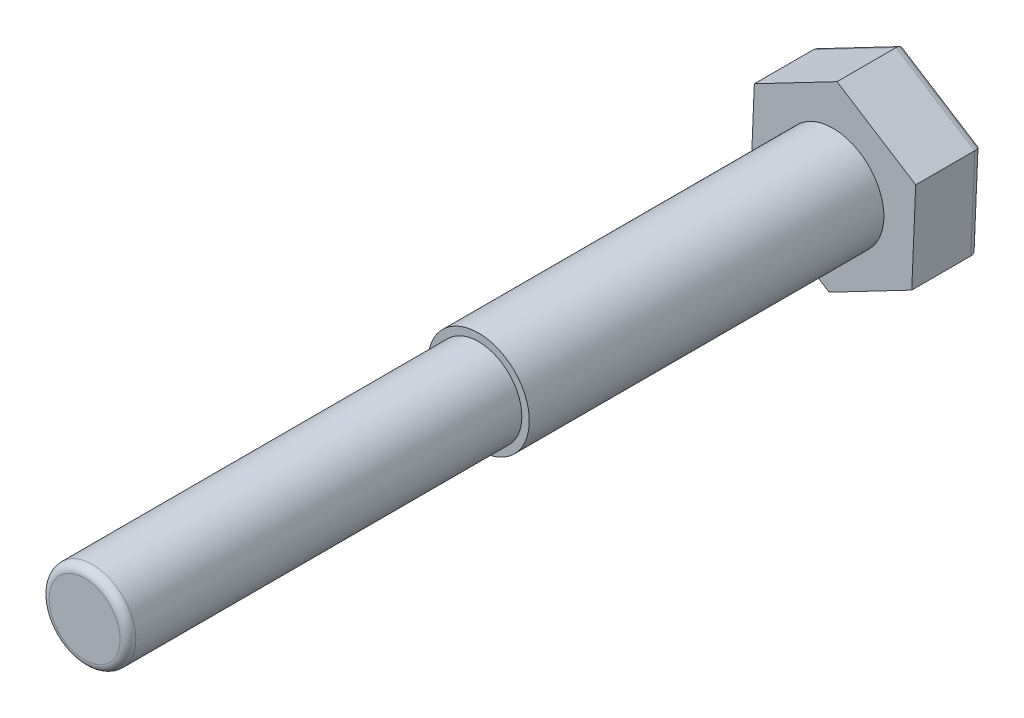
ISO-10303-21;
HEADER;
FILE_DESCRIPTION(('STEP AP214'),'2;1');
FILE_NAME('part.step','',(''),(''),'','','');
FILE_SCHEMA(('AUTOMOTIVE_DESIGN { 1 0 10303 214 1 1 1 1 }'));
ENDSEC;
DATA;
#1=APPLICATION_CONTEXT('core data for automotive mechanical design processes');
#2=APPLICATION_PROTOCOL_DEFINITION('international standard','automotive_design',2000,#1);
#3=PRODUCT_CONTEXT('',#1,'mechanical');
#4=PRODUCT('Part','Part','',(#3));
#5=PRODUCT_RELATED_PRODUCT_CATEGORY('part','',(#4));
#6=PRODUCT_DEFINITION_FORMATION('','',#4);
#7=PRODUCT_DEFINITION_CONTEXT('part definition',#1,'design');
#8=PRODUCT_DEFINITION('design','',#6,#7);
#9=PRODUCT_DEFINITION_SHAPE('','',#8);
#10=(LENGTH_UNIT() NAMED_UNIT(*) SI_UNIT(.MILLI.,.METRE.));
#11=(NAMED_UNIT(*) PLANE_ANGLE_UNIT() SI_UNIT($,.RADIAN.));
#12=(NAMED_UNIT(*) SI_UNIT($,.STERADIAN.) SOLID_ANGLE_UNIT());
#13=UNCERTAINTY_MEASURE_WITH_UNIT(LENGTH_MEASURE(1.E-05),#10,'distance_accuracy_value','');
#14=(GEOMETRIC_REPRESENTATION_CONTEXT(3) GLOBAL_UNCERTAINTY_ASSIGNED_CONTEXT((#13)) GLOBAL_UNIT_ASSIGNED_CONTEXT((#10,
#11,#12)) REPRESENTATION_CONTEXT('',''));
#15=CARTESIAN_POINT('',(0.,0.,0.));
#16=DIRECTION('',(0.,0.,1.));
#17=DIRECTION('',(1.,0.,0.));
#18=AXIS2_PLACEMENT_3D('',#15,#16,#17);
#19=CARTESIAN_POINT('',(19.9787997617734,-12.6957037383635,17.));
#20=DIRECTION('',(-0.999097599975706,0.0424733530909036,0.));
#21=DIRECTION('',(-0.0424733530909036,-0.999097599975706,0.));
#22=AXIS2_PLACEMENT_3D('',#19,#20,#21);
#23=PLANE('',#22);
#24=DIRECTION('',(0.,0.,-1.));
#25=VECTOR('',#24,1.);
#26=CARTESIAN_POINT('',(19.9787997617734,-12.6957037383635,17.));
#27=LINE('',#26,#25);
#28=CARTESIAN_POINT('',(19.9787997617734,-12.6957037383635,17.));
#29=VERTEX_POINT('',#28);
#30=CARTESIAN_POINT('',(19.9787997617734,-12.6957037383635,2.));
#31=VERTEX_POINT('',#30);
#32=EDGE_CURVE('E257',#29,#31,#27,.T.);
#33=ORIENTED_EDGE('',*,*,#32,.T.);
#34=DIRECTION('',(0.0424733530909036,0.999097599975706,0.));
#35=VECTOR('',#34,1.);
#36=CARTESIAN_POINT('',(20.9842018372306,10.9542962616365,2.));
#37=LINE('',#36,#35);
#38=CARTESIAN_POINT('',(20.9842018372306,10.9542962616365,2.));
#39=VERTEX_POINT('',#38);
#40=EDGE_CURVE('E132',#31,#39,#37,.T.);
#41=ORIENTED_EDGE('',*,*,#40,.T.);
#42=DIRECTION('',(0.,0.,-1.));
#43=VECTOR('',#42,1.);
#44=CARTESIAN_POINT('',(20.9842018372306,10.9542962616365,17.));
#45=LINE('',#44,#43);
#46=CARTESIAN_POINT('',(20.9842018372306,10.9542962616365,17.));
#47=VERTEX_POINT('',#46);
#48=EDGE_CURVE('E115',#47,#39,#45,.T.);
#49=ORIENTED_EDGE('',*,*,#48,.F.);
#50=DIRECTION('',(0.0424733530909036,0.999097599975706,0.));
#51=VECTOR('',#50,1.);
#52=CARTESIAN_POINT('',(19.9787997617734,-12.6957037383635,17.));
#53=LINE('',#52,#51);
#54=EDGE_CURVE('E122',#29,#47,#53,.T.);
#55=ORIENTED_EDGE('',*,*,#54,.F.);
#56=EDGE_LOOP('',(#33,#41,#49,#55));
#57=FACE_BOUND('',#56,.T.);
#58=ADVANCED_FACE('F36',(#57),#23,.F.);
#59=CARTESIAN_POINT('',(20.9842018372306,10.9542962616365,17.));
#60=DIRECTION('',(-0.536331802748482,-0.844007225893572,0.));
#61=DIRECTION('',(0.844007225893572,-0.536331802748482,0.));
#62=AXIS2_PLACEMENT_3D('',#59,#60,#61);
#63=PLANE('',#62);
#64=ORIENTED_EDGE('',*,*,#48,.T.);
#65=DIRECTION('',(-0.844007225893572,0.536331802748482,0.));
#66=VECTOR('',#65,1.);
#67=CARTESIAN_POINT('',(1.00540207545719,23.65,2.));
#68=LINE('',#67,#66);
#69=CARTESIAN_POINT('',(1.0054020754572,23.65,2.));
#70=VERTEX_POINT('',#69);
#71=EDGE_CURVE('E136',#39,#70,#68,.T.);
#72=ORIENTED_EDGE('',*,*,#71,.T.);
#73=DIRECTION('',(0.,0.,-1.));
#74=VECTOR('',#73,1.);
#75=CARTESIAN_POINT('',(1.0054020754572,23.65,17.));
#76=LINE('',#75,#74);
#77=CARTESIAN_POINT('',(1.0054020754572,23.65,17.));
#78=VERTEX_POINT('',#77);
#79=EDGE_CURVE('E118',#78,#70,#76,.T.);
#80=ORIENTED_EDGE('',*,*,#79,.F.);
#81=DIRECTION('',(-0.844007225893572,0.536331802748482,0.));
#82=VECTOR('',#81,1.);
#83=CARTESIAN_POINT('',(20.9842018372306,10.9542962616365,17.));
#84=LINE('',#83,#82);
#85=EDGE_CURVE('E110',#47,#78,#84,.T.);
#86=ORIENTED_EDGE('',*,*,#85,.F.);
#87=EDGE_LOOP('',(#64,#72,#80,#86));
#88=FACE_BOUND('',#87,.T.);
#89=ADVANCED_FACE('F112',(#88),#63,.F.);
#90=CARTESIAN_POINT('',(1.0054020754572,23.65,17.));
#91=DIRECTION('',(0.462765797227231,-0.886480578984472,0.));
#92=DIRECTION('',(0.886480578984472,0.462765797227231,0.));
#93=AXIS2_PLACEMENT_3D('',#90,#91,#92);
#94=PLANE('',#93);
#95=ORIENTED_EDGE('',*,*,#79,.T.);
#96=DIRECTION('',(-0.886480578984472,-0.462765797227231,0.));
#97=VECTOR('',#96,1.);
#98=CARTESIAN_POINT('',(-19.9787997617736,12.6957037383632,2.));
#99=LINE('',#98,#97);
#100=CARTESIAN_POINT('',(-19.9787997617736,12.6957037383632,2.));
#101=VERTEX_POINT('',#100);
#102=EDGE_CURVE('E156',#70,#101,#99,.T.);
#103=ORIENTED_EDGE('',*,*,#102,.T.);
#104=DIRECTION('',(0.,0.,-1.));
#105=VECTOR('',#104,1.);
#106=CARTESIAN_POINT('',(-19.9787997617736,12.6957037383632,17.));
#107=LINE('',#106,#105);
#108=CARTESIAN_POINT('',(-19.9787997617736,12.6957037383632,17.));
#109=VERTEX_POINT('',#108);
#110=EDGE_CURVE('E138',#109,#101,#107,.T.);
#111=ORIENTED_EDGE('',*,*,#110,.F.);
#112=DIRECTION('',(-0.886480578984472,-0.462765797227231,0.));
#113=VECTOR('',#112,1.);
#114=CARTESIAN_POINT('',(1.0054020754572,23.65,17.));
#115=LINE('',#114,#113);
#116=EDGE_CURVE('E121',#78,#109,#115,.T.);
#117=ORIENTED_EDGE('',*,*,#116,.F.);
#118=EDGE_LOOP('',(#95,#103,#111,#117));
#119=FACE_BOUND('',#118,.T.);
#120=ADVANCED_FACE('F197',(#119),#94,.F.);
#121=CARTESIAN_POINT('',(-19.9787997617736,12.6957037383632,17.));
#122=DIRECTION('',(0.999097599975706,-0.0424733530908878,0.));
#123=DIRECTION('',(0.0424733530908878,0.999097599975707,0.));
#124=AXIS2_PLACEMENT_3D('',#121,#122,#123);
#125=PLANE('',#124);
#126=ORIENTED_EDGE('',*,*,#110,.T.);
#127=DIRECTION('',(-0.0424733530908878,-0.999097599975707,0.));
#128=VECTOR('',#127,1.);
#129=CARTESIAN_POINT('',(-20.9842018372304,-10.9542962616368,2.));
#130=LINE('',#129,#128);
#131=CARTESIAN_POINT('',(-20.9842018372304,-10.9542962616368,2.));
#132=VERTEX_POINT('',#131);
#133=EDGE_CURVE('E158',#101,#132,#130,.T.);
#134=ORIENTED_EDGE('',*,*,#133,.T.);
#135=DIRECTION('',(0.,0.,-1.));
#136=VECTOR('',#135,1.);
#137=CARTESIAN_POINT('',(-20.9842018372304,-10.9542962616368,17.));
#138=LINE('',#137,#136);
#139=CARTESIAN_POINT('',(-20.9842018372304,-10.9542962616368,17.));
#140=VERTEX_POINT('',#139);
#141=EDGE_CURVE('E261',#140,#132,#138,.T.);
#142=ORIENTED_EDGE('',*,*,#141,.F.);
#143=DIRECTION('',(-0.0424733530908878,-0.999097599975706,0.));
#144=VECTOR('',#143,1.);
#145=CARTESIAN_POINT('',(-19.9787997617736,12.6957037383632,17.));
#146=LINE('',#145,#144);
#147=EDGE_CURVE('E250',#109,#140,#146,.T.);
#148=ORIENTED_EDGE('',*,*,#147,.F.);
#149=EDGE_LOOP('',(#126,#134,#142,#148));
#150=FACE_BOUND('',#149,.T.);
#151=ADVANCED_FACE('F263',(#150),#125,.F.);
#152=CARTESIAN_POINT('',(-20.9842018372304,-10.9542962616368,17.));
#153=DIRECTION('',(0.536331802748476,0.844007225893576,0.));
#154=DIRECTION('',(-0.844007225893576,0.536331802748476,0.));
#155=AXIS2_PLACEMENT_3D('',#152,#153,#154);
#156=PLANE('',#155);
#157=ORIENTED_EDGE('',*,*,#141,.T.);
#158=DIRECTION('',(0.844007225893576,-0.536331802748476,0.));
#159=VECTOR('',#158,1.);
#160=CARTESIAN_POINT('',(-1.00540207545719,-23.65,2.));
#161=LINE('',#160,#159);
#162=CARTESIAN_POINT('',(-1.00540207545719,-23.65,2.));
#163=VERTEX_POINT('',#162);
#164=EDGE_CURVE('E59',#132,#163,#161,.T.);
#165=ORIENTED_EDGE('',*,*,#164,.T.);
#166=DIRECTION('',(0.,0.,-1.));
#167=VECTOR('',#166,1.);
#168=CARTESIAN_POINT('',(-1.00540207545719,-23.65,17.));
#169=LINE('',#168,#167);
#170=CARTESIAN_POINT('',(-1.00540207545719,-23.65,17.));
#171=VERTEX_POINT('',#170);
#172=EDGE_CURVE('E259',#171,#163,#169,.T.);
#173=ORIENTED_EDGE('',*,*,#172,.F.);
#174=DIRECTION('',(0.844007225893576,-0.536331802748476,0.));
#175=VECTOR('',#174,1.);
#176=CARTESIAN_POINT('',(-20.9842018372304,-10.9542962616368,17.));
#177=LINE('',#176,#175);
#178=EDGE_CURVE('E252',#140,#171,#177,.T.);
#179=ORIENTED_EDGE('',*,*,#178,.F.);
#180=EDGE_LOOP('',(#157,#165,#173,#179));
#181=FACE_BOUND('',#180,.T.);
#182=ADVANCED_FACE('F266',(#181),#156,.F.);
#183=CARTESIAN_POINT('',(-1.00540207545719,-23.65,17.));
#184=DIRECTION('',(-0.462765797227224,0.886480578984476,0.));
#185=DIRECTION('',(-0.886480578984476,-0.462765797227224,0.));
#186=AXIS2_PLACEMENT_3D('',#183,#184,#185);
#187=PLANE('',#186);
#188=ORIENTED_EDGE('',*,*,#172,.T.);
#189=DIRECTION('',(0.886480578984476,0.462765797227224,0.));
#190=VECTOR('',#189,1.);
#191=CARTESIAN_POINT('',(19.9787997617734,-12.6957037383635,2.));
#192=LINE('',#191,#190);
#193=EDGE_CURVE('E51',#163,#31,#192,.T.);
#194=ORIENTED_EDGE('',*,*,#193,.T.);
#195=ORIENTED_EDGE('',*,*,#32,.F.);
#196=DIRECTION('',(0.886480578984476,0.462765797227224,0.));
#197=VECTOR('',#196,1.);
#198=CARTESIAN_POINT('',(-1.00540207545719,-23.65,17.));
#199=LINE('',#198,#197);
#200=EDGE_CURVE('E127',#171,#29,#199,.T.);
#201=ORIENTED_EDGE('',*,*,#200,.F.);
#202=EDGE_LOOP('',(#188,#194,#195,#201));
#203=FACE_BOUND('',#202,.T.);
#204=ADVANCED_FACE('F267',(#203),#187,.F.);
#205=CARTESIAN_POINT('',(18.9733976863162,-36.3457037383633,17.));
#206=DIRECTION('',(0.,0.,-1.));
#207=DIRECTION('',(-1.,0.,0.));
#208=AXIS2_PLACEMENT_3D('',#205,#206,#207);
#209=PLANE('',#208);
#210=CARTESIAN_POINT('',(0.,0.,17.));
#211=DIRECTION('',(0.,0.,-1.));
#212=DIRECTION('',(-1.,0.,0.));
#213=AXIS2_PLACEMENT_3D('',#210,#211,#212);
#214=CIRCLE('',#213,12.9);
#215=CARTESIAN_POINT('',(-12.9,0.,17.));
#216=VERTEX_POINT('',#215);
#217=EDGE_CURVE('E133',#216,#216,#214,.F.);
#218=ORIENTED_EDGE('',*,*,#217,.F.);
#219=EDGE_LOOP('',(#218));
#220=FACE_BOUND('',#219,.T.);
#221=ORIENTED_EDGE('',*,*,#54,.T.);
#222=ORIENTED_EDGE('',*,*,#85,.T.);
#223=ORIENTED_EDGE('',*,*,#116,.T.);
#224=ORIENTED_EDGE('',*,*,#147,.T.);
#225=ORIENTED_EDGE('',*,*,#178,.T.);
#226=ORIENTED_EDGE('',*,*,#200,.T.);
#227=EDGE_LOOP('',(#221,#222,#223,#224,#225,#226));
#228=FACE_BOUND('',#227,.T.);
#229=ADVANCED_FACE('F125',(#220,#228),#209,.F.);
#230=CARTESIAN_POINT('',(18.9733976863162,-36.3457037383633,0.));
#231=DIRECTION('',(0.,0.,-1.));
#232=DIRECTION('',(-1.,0.,0.));
#233=AXIS2_PLACEMENT_3D('',#230,#231,#232);
#234=PLANE('',#233);
#235=DIRECTION('',(-0.886480578984472,-0.462765797227231,0.));
#236=VECTOR('',#235,1.);
#237=CARTESIAN_POINT('',(1.93093366991166,21.8770388420311,0.));
#238=LINE('',#237,#236);
#239=CARTESIAN_POINT('',(-18.029648565503,11.4570984955961,0.));
#240=VERTEX_POINT('',#239);
#241=CARTESIAN_POINT('',(0.907314068095531,21.3426829268293,0.));
#242=VERTEX_POINT('',#241);
#243=EDGE_CURVE('E151',#240,#242,#238,.F.);
#244=ORIENTED_EDGE('',*,*,#243,.T.);
#245=DIRECTION('',(-0.844007225893572,0.536331802748482,0.));
#246=VECTOR('',#245,1.);
#247=CARTESIAN_POINT('',(19.9115382317336,9.26628180984933,0.));
#248=LINE('',#247,#246);
#249=CARTESIAN_POINT('',(18.9369626335983,9.88558443123292,0.));
#250=VERTEX_POINT('',#249);
#251=EDGE_CURVE('E153',#242,#250,#248,.F.);
#252=ORIENTED_EDGE('',*,*,#251,.T.);
#253=DIRECTION('',(0.0424733530909036,0.999097599975706,0.));
#254=VECTOR('',#253,1.);
#255=CARTESIAN_POINT('',(17.980604561822,-12.6107570321817,0.));
#256=LINE('',#255,#254);
#257=CARTESIAN_POINT('',(18.0296485655028,-11.4570984955964,0.));
#258=VERTEX_POINT('',#257);
#259=EDGE_CURVE('E143',#250,#258,#256,.F.);
#260=ORIENTED_EDGE('',*,*,#259,.T.);
#261=DIRECTION('',(0.886480578984476,0.462765797227224,0.));
#262=VECTOR('',#261,1.);
#263=CARTESIAN_POINT('',(-1.93093366991164,-21.877038842031,0.));
#264=LINE('',#263,#262);
#265=CARTESIAN_POINT('',(-0.90731406809552,-21.3426829268293,0.));
#266=VERTEX_POINT('',#265);
#267=EDGE_CURVE('E145',#258,#266,#264,.F.);
#268=ORIENTED_EDGE('',*,*,#267,.T.);
#269=DIRECTION('',(0.844007225893576,-0.536331802748476,0.));
#270=VECTOR('',#269,1.);
#271=CARTESIAN_POINT('',(-19.9115382317334,-9.26628180984964,0.));
#272=LINE('',#271,#270);
#273=CARTESIAN_POINT('',(-18.9369626335981,-9.88558443123322,0.));
#274=VERTEX_POINT('',#273);
#275=EDGE_CURVE('E147',#266,#274,#272,.F.);
#276=ORIENTED_EDGE('',*,*,#275,.T.);
#277=DIRECTION('',(-0.0424733530908878,-0.999097599975707,0.));
#278=VECTOR('',#277,1.);
#279=CARTESIAN_POINT('',(-17.9806045618221,12.6107570321814,0.));
#280=LINE('',#279,#278);
#281=EDGE_CURVE('E149',#274,#240,#280,.F.);
#282=ORIENTED_EDGE('',*,*,#281,.T.);
#283=EDGE_LOOP('',(#244,#252,#260,#268,#276,#282));
#284=FACE_BOUND('',#283,.T.);
#285=ADVANCED_FACE('F238',(#284),#234,.T.);
#286=CARTESIAN_POINT('',(0.,0.,107.));
#287=DIRECTION('',(0.,0.,-1.));
#288=DIRECTION('',(-1.,0.,0.));
#289=AXIS2_PLACEMENT_3D('',#286,#287,#288);
#290=CYLINDRICAL_SURFACE('',#289,12.9);
#291=CARTESIAN_POINT('',(0.,0.,107.));
#292=DIRECTION('',(0.,0.,1.));
#293=DIRECTION('',(1.,0.,0.));
#294=AXIS2_PLACEMENT_3D('',#291,#292,#293);
#295=CIRCLE('',#294,12.9);
#296=CARTESIAN_POINT('',(-12.9,0.,107.));
#297=VERTEX_POINT('',#296);
#298=EDGE_CURVE('E129',#297,#297,#295,.T.);
#299=CARTESIAN_POINT('',(-12.9,0.,107.));
#300=CARTESIAN_POINT('',(-12.9,0.,106.0625));
#301=CARTESIAN_POINT('',(-12.9,0.,105.125));
#302=CARTESIAN_POINT('',(-12.9,0.,103.25));
#303=CARTESIAN_POINT('',(-12.9,0.,102.3125));
#304=CARTESIAN_POINT('',(-12.9,0.,100.4375));
#305=CARTESIAN_POINT('',(-12.9,0.,99.5));
#306=CARTESIAN_POINT('',(-12.9,0.,97.625));
#307=CARTESIAN_POINT('',(-12.9,0.,96.6875));
#308=CARTESIAN_POINT('',(-12.9,0.,94.8125));
#309=CARTESIAN_POINT('',(-12.9,0.,93.875));
#310=CARTESIAN_POINT('',(-12.9,0.,92.));
#311=CARTESIAN_POINT('',(-12.9,0.,91.0625));
#312=CARTESIAN_POINT('',(-12.9,0.,89.1875));
#313=CARTESIAN_POINT('',(-12.9,0.,88.25));
#314=CARTESIAN_POINT('',(-12.9,0.,86.375));
#315=CARTESIAN_POINT('',(-12.9,0.,85.4375));
#316=CARTESIAN_POINT('',(-12.9,0.,83.5625));
#317=CARTESIAN_POINT('',(-12.9,0.,82.625));
#318=CARTESIAN_POINT('',(-12.9,0.,80.75));
#319=CARTESIAN_POINT('',(-12.9,0.,79.8125));
#320=CARTESIAN_POINT('',(-12.9,0.,77.9375));
#321=CARTESIAN_POINT('',(-12.9,0.,77.));
#322=CARTESIAN_POINT('',(-12.9,0.,75.125));
#323=CARTESIAN_POINT('',(-12.9,0.,74.1875));
#324=CARTESIAN_POINT('',(-12.9,0.,72.3125));
#325=CARTESIAN_POINT('',(-12.9,0.,71.375));
#326=CARTESIAN_POINT('',(-12.9,0.,69.5));
#327=CARTESIAN_POINT('',(-12.9,0.,68.5625));
#328=CARTESIAN_POINT('',(-12.9,0.,66.6875));
#329=CARTESIAN_POINT('',(-12.9,0.,65.75));
#330=CARTESIAN_POINT('',(-12.9,0.,63.875));
#331=CARTESIAN_POINT('',(-12.9,0.,62.9375));
#332=CARTESIAN_POINT('',(-12.9,0.,61.0625));
#333=CARTESIAN_POINT('',(-12.9,0.,60.125));
#334=CARTESIAN_POINT('',(-12.9,0.,58.25));
#335=CARTESIAN_POINT('',(-12.9,0.,57.3125));
#336=CARTESIAN_POINT('',(-12.9,0.,55.4375));
#337=CARTESIAN_POINT('',(-12.9,0.,54.5));
#338=CARTESIAN_POINT('',(-12.9,0.,52.625));
#339=CARTESIAN_POINT('',(-12.9,0.,51.6875));
#340=CARTESIAN_POINT('',(-12.9,0.,49.8125));
#341=CARTESIAN_POINT('',(-12.9,0.,48.875));
#342=CARTESIAN_POINT('',(-12.9,0.,47.));
#343=CARTESIAN_POINT('',(-12.9,0.,46.0625));
#344=CARTESIAN_POINT('',(-12.9,0.,44.1875));
#345=CARTESIAN_POINT('',(-12.9,0.,43.25));
#346=CARTESIAN_POINT('',(-12.9,0.,41.375));
#347=CARTESIAN_POINT('',(-12.9,0.,40.4375));
#348=CARTESIAN_POINT('',(-12.9,0.,38.5625));
#349=CARTESIAN_POINT('',(-12.9,0.,37.625));
#350=CARTESIAN_POINT('',(-12.9,0.,35.75));
#351=CARTESIAN_POINT('',(-12.9,0.,34.8125));
#352=CARTESIAN_POINT('',(-12.9,0.,32.9375));
#353=CARTESIAN_POINT('',(-12.9,0.,32.));
#354=CARTESIAN_POINT('',(-12.9,0.,30.125));
#355=CARTESIAN_POINT('',(-12.9,0.,29.1875));
#356=CARTESIAN_POINT('',(-12.9,0.,27.3125));
#357=CARTESIAN_POINT('',(-12.9,0.,26.375));
#358=CARTESIAN_POINT('',(-12.9,0.,24.5));
#359=CARTESIAN_POINT('',(-12.9,0.,23.5625));
#360=CARTESIAN_POINT('',(-12.9,0.,21.6875));
#361=CARTESIAN_POINT('',(-12.9,0.,20.75));
#362=CARTESIAN_POINT('',(-12.9,0.,18.875));
#363=CARTESIAN_POINT('',(-12.9,0.,17.9375));
#364=CARTESIAN_POINT('',(-12.9,0.,17.));
#365=B_SPLINE_CURVE_WITH_KNOTS('',3,(#299,#300,#301,#302,#303,#304,#305,#306,#307,#308,#309,
#310,#311,#312,#313,#314,#315,#316,#317,#318,#319,#320,#321,#322,#323,#324,#325,#326,#327,#328,
#329,#330,#331,#332,#333,#334,#335,#336,#337,#338,#339,#340,#341,#342,#343,#344,#345,#346,#347,
#348,#349,#350,#351,#352,#353,#354,#355,#356,#357,#358,#359,#360,#361,#362,#363,#364),
.UNSPECIFIED.,.F.,.F.,(4,2,2,2,2,2,2,2,2,2,2,2,2,2,2,2,2,2,2,2,2,2,2,2,2,2,2,2,2,2,2,2,4),(0.,
2.81250000000001,5.62500000000001,8.4375,11.25,14.0625,16.875,19.6875,22.5,25.3125,28.125,
30.9375,33.75,36.5625,39.375,42.1875,45.,47.8125,50.625,53.4375,56.25,59.0625,61.875,64.6875,
67.5,70.3125,73.125,75.9375,78.75,81.5625,84.375,87.1875,90.),.UNSPECIFIED.);
#366=EDGE_CURVE('BSEAM227',#297,#216,#365,.T.);
#367=ORIENTED_EDGE('',*,*,#298,.F.);
#368=ORIENTED_EDGE('',*,*,#217,.T.);
#369=ORIENTED_EDGE('',*,*,#366,.T.);
#370=ORIENTED_EDGE('',*,*,#366,.F.);
#371=EDGE_LOOP('',(#367,#369,#368,#370));
#372=FACE_BOUND('',#371,.T.);
#373=ADVANCED_FACE('F227',(#372),#290,.T.);
#374=CARTESIAN_POINT('',(0.,0.,107.));
#375=DIRECTION('',(0.,0.,1.));
#376=DIRECTION('',(1.,0.,0.));
#377=AXIS2_PLACEMENT_3D('',#374,#375,#376);
#378=PLANE('',#377);
#379=CARTESIAN_POINT('',(0.,0.,107.));
#380=DIRECTION('',(0.,0.,1.));
#381=DIRECTION('',(1.,0.,0.));
#382=AXIS2_PLACEMENT_3D('',#379,#380,#381);
#383=CIRCLE('',#382,11.);
#384=CARTESIAN_POINT('',(11.,0.,107.));
#385=VERTEX_POINT('',#384);
#386=EDGE_CURVE('E166',#385,#385,#383,.T.);
#387=ORIENTED_EDGE('',*,*,#386,.F.);
#388=EDGE_LOOP('',(#387));
#389=FACE_BOUND('',#388,.T.);
#390=ORIENTED_EDGE('',*,*,#298,.T.);
#391=EDGE_LOOP('',(#390));
#392=FACE_BOUND('',#391,.T.);
#393=ADVANCED_FACE('F222',(#389,#392),#378,.T.);
#394=CARTESIAN_POINT('',(-19.9115382317334,-9.26628180984964,2.));
#395=DIRECTION('',(-0.844007225893576,0.536331802748476,0.));
#396=DIRECTION('',(-0.536331802748476,-0.844007225893576,0.));
#397=AXIS2_PLACEMENT_3D('',#394,#395,#396);
#398=CYLINDRICAL_SURFACE('',#397,2.);
#399=CARTESIAN_POINT('',(-18.9369626335981,-9.88558443123322,2.));
#400=DIRECTION('',(-0.462765797227234,0.886480578984471,0.));
#401=DIRECTION('',(-0.886480578984471,-0.462765797227234,0.));
#402=AXIS2_PLACEMENT_3D('',#399,#400,#401);
#403=ELLIPSE('',#402,2.3094010767585,2.);
#404=EDGE_CURVE('E174',#274,#132,#403,.T.);
#405=ORIENTED_EDGE('',*,*,#404,.F.);
#406=ORIENTED_EDGE('',*,*,#275,.F.);
#407=CARTESIAN_POINT('',(-0.90731406809552,-21.3426829268293,2.));
#408=DIRECTION('',(-0.999097599975706,0.0424733530909003,0.));
#409=DIRECTION('',(-0.0424733530909002,-0.999097599975706,0.));
#410=AXIS2_PLACEMENT_3D('',#407,#408,#409);
#411=ELLIPSE('',#410,2.3094010767585,2.);
#412=EDGE_CURVE('E177',#163,#266,#411,.F.);
#413=ORIENTED_EDGE('',*,*,#412,.F.);
#414=ORIENTED_EDGE('',*,*,#164,.F.);
#415=EDGE_LOOP('',(#405,#406,#413,#414));
#416=FACE_BOUND('',#415,.T.);
#417=ADVANCED_FACE('F219',(#416),#398,.T.);
#418=CARTESIAN_POINT('',(-1.93093366991164,-21.877038842031,2.));
#419=DIRECTION('',(-0.886480578984476,-0.462765797227224,0.));
#420=DIRECTION('',(0.462765797227224,-0.886480578984476,0.));
#421=AXIS2_PLACEMENT_3D('',#418,#419,#420);
#422=CYLINDRICAL_SURFACE('',#421,2.);
#423=ORIENTED_EDGE('',*,*,#412,.T.);
#424=ORIENTED_EDGE('',*,*,#267,.F.);
#425=CARTESIAN_POINT('',(18.0296485655028,-11.4570984955964,2.));
#426=DIRECTION('',(-0.536331802748482,-0.844007225893572,0.));
#427=DIRECTION('',(0.844007225893572,-0.536331802748482,0.));
#428=AXIS2_PLACEMENT_3D('',#425,#426,#427);
#429=ELLIPSE('',#428,2.3094010767585,2.);
#430=EDGE_CURVE('E171',#31,#258,#429,.F.);
#431=ORIENTED_EDGE('',*,*,#430,.F.);
#432=ORIENTED_EDGE('',*,*,#193,.F.);
#433=EDGE_LOOP('',(#423,#424,#431,#432));
#434=FACE_BOUND('',#433,.T.);
#435=ADVANCED_FACE('F216',(#434),#422,.T.);
#436=CARTESIAN_POINT('',(-17.9806045618221,12.6107570321814,2.));
#437=DIRECTION('',(0.0424733530908878,0.999097599975707,0.));
#438=DIRECTION('',(-0.999097599975707,0.0424733530908878,0.));
#439=AXIS2_PLACEMENT_3D('',#436,#437,#438);
#440=CYLINDRICAL_SURFACE('',#439,2.);
#441=ORIENTED_EDGE('',*,*,#404,.T.);
#442=ORIENTED_EDGE('',*,*,#133,.F.);
#443=CARTESIAN_POINT('',(-18.029648565503,11.457098495596,2.));
#444=DIRECTION('',(0.536331802748472,0.844007225893579,0.));
#445=DIRECTION('',(-0.844007225893579,0.536331802748472,0.));
#446=AXIS2_PLACEMENT_3D('',#443,#444,#445);
#447=ELLIPSE('',#446,2.30940107675851,2.);
#448=EDGE_CURVE('E168',#240,#101,#447,.T.);
#449=ORIENTED_EDGE('',*,*,#448,.F.);
#450=ORIENTED_EDGE('',*,*,#281,.F.);
#451=EDGE_LOOP('',(#441,#442,#449,#450));
#452=FACE_BOUND('',#451,.T.);
#453=ADVANCED_FACE('F212',(#452),#440,.T.);
#454=CARTESIAN_POINT('',(17.980604561822,-12.6107570321817,2.));
#455=DIRECTION('',(-0.0424733530909036,-0.999097599975706,0.));
#456=DIRECTION('',(0.999097599975706,-0.0424733530909036,0.));
#457=AXIS2_PLACEMENT_3D('',#454,#455,#456);
#458=CYLINDRICAL_SURFACE('',#457,2.);
#459=ORIENTED_EDGE('',*,*,#430,.T.);
#460=ORIENTED_EDGE('',*,*,#259,.F.);
#461=CARTESIAN_POINT('',(18.9369626335983,9.88558443123291,2.));
#462=DIRECTION('',(0.462765797227224,-0.886480578984476,0.));
#463=DIRECTION('',(-0.886480578984476,-0.462765797227224,0.));
#464=AXIS2_PLACEMENT_3D('',#461,#462,#463);
#465=ELLIPSE('',#464,2.3094010767585,2.);
#466=EDGE_CURVE('E165',#39,#250,#465,.F.);
#467=ORIENTED_EDGE('',*,*,#466,.F.);
#468=ORIENTED_EDGE('',*,*,#40,.F.);
#469=EDGE_LOOP('',(#459,#460,#467,#468));
#470=FACE_BOUND('',#469,.T.);
#471=ADVANCED_FACE('F208',(#470),#458,.T.);
#472=CARTESIAN_POINT('',(1.93093366991166,21.8770388420311,2.));
#473=DIRECTION('',(0.886480578984472,0.462765797227231,0.));
#474=DIRECTION('',(-0.462765797227231,0.886480578984472,0.));
#475=AXIS2_PLACEMENT_3D('',#472,#473,#474);
#476=CYLINDRICAL_SURFACE('',#475,2.);
#477=ORIENTED_EDGE('',*,*,#448,.T.);
#478=ORIENTED_EDGE('',*,*,#102,.F.);
#479=CARTESIAN_POINT('',(0.907314068095525,21.3426829268293,2.));
#480=DIRECTION('',(0.999097599975706,-0.0424733530908997,0.));
#481=DIRECTION('',(0.0424733530908995,0.999097599975706,0.));
#482=AXIS2_PLACEMENT_3D('',#479,#480,#481);
#483=ELLIPSE('',#482,2.30940107675851,2.);
#484=EDGE_CURVE('E163',#242,#70,#483,.T.);
#485=ORIENTED_EDGE('',*,*,#484,.F.);
#486=ORIENTED_EDGE('',*,*,#243,.F.);
#487=EDGE_LOOP('',(#477,#478,#485,#486));
#488=FACE_BOUND('',#487,.T.);
#489=ADVANCED_FACE('F204',(#488),#476,.T.);
#490=CARTESIAN_POINT('',(19.9115382317336,9.26628180984933,2.));
#491=DIRECTION('',(0.844007225893572,-0.536331802748482,0.));
#492=DIRECTION('',(0.536331802748482,0.844007225893572,0.));
#493=AXIS2_PLACEMENT_3D('',#490,#491,#492);
#494=CYLINDRICAL_SURFACE('',#493,2.);
#495=ORIENTED_EDGE('',*,*,#466,.T.);
#496=ORIENTED_EDGE('',*,*,#251,.F.);
#497=ORIENTED_EDGE('',*,*,#484,.T.);
#498=ORIENTED_EDGE('',*,*,#71,.F.);
#499=EDGE_LOOP('',(#495,#496,#497,#498));
#500=FACE_BOUND('',#499,.T.);
#501=ADVANCED_FACE('F201',(#500),#494,.T.);
#502=CARTESIAN_POINT('',(0.,0.,207.));
#503=DIRECTION('',(0.,0.,-1.));
#504=DIRECTION('',(-1.,0.,0.));
#505=AXIS2_PLACEMENT_3D('',#502,#503,#504);
#506=CYLINDRICAL_SURFACE('',#505,11.);
#507=CARTESIAN_POINT('',(0.,0.,205.));
#508=DIRECTION('',(0.,0.,1.));
#509=DIRECTION('',(1.,0.,0.));
#510=AXIS2_PLACEMENT_3D('',#507,#508,#509);
#511=CIRCLE('',#510,11.);
#512=CARTESIAN_POINT('',(11.,0.,205.));
#513=VERTEX_POINT('',#512);
#514=EDGE_CURVE('E11',#513,#513,#511,.F.);
#515=ORIENTED_EDGE('',*,*,#514,.T.);
#516=EDGE_LOOP('',(#515));
#517=FACE_BOUND('',#516,.T.);
#518=ORIENTED_EDGE('',*,*,#386,.T.);
#519=EDGE_LOOP('',(#518));
#520=FACE_BOUND('',#519,.T.);
#521=ADVANCED_FACE('F189',(#517,#520),#506,.T.);
#522=CARTESIAN_POINT('',(0.,0.,207.));
#523=DIRECTION('',(0.,0.,1.));
#524=DIRECTION('',(1.,0.,0.));
#525=AXIS2_PLACEMENT_3D('',#522,#523,#524);
#526=PLANE('',#525);
#527=CARTESIAN_POINT('',(0.,0.,207.));
#528=DIRECTION('',(0.,0.,1.));
#529=DIRECTION('',(1.,0.,0.));
#530=AXIS2_PLACEMENT_3D('',#527,#528,#529);
#531=CIRCLE('',#530,9.);
#532=CARTESIAN_POINT('',(9.,0.,207.));
#533=VERTEX_POINT('',#532);
#534=EDGE_CURVE('E44',#533,#533,#531,.T.);
#535=ORIENTED_EDGE('',*,*,#534,.T.);
#536=EDGE_LOOP('',(#535));
#537=FACE_BOUND('',#536,.T.);
#538=ADVANCED_FACE('F182',(#537),#526,.T.);
#539=CARTESIAN_POINT('',(0.,0.,205.));
#540=DIRECTION('',(0.,0.,1.));
#541=DIRECTION('',(1.,0.,0.));
#542=AXIS2_PLACEMENT_3D('',#539,#540,#541);
#543=TOROIDAL_SURFACE('',#542,9.,2.);
#544=ORIENTED_EDGE('',*,*,#514,.F.);
#545=EDGE_LOOP('',(#544));
#546=FACE_BOUND('',#545,.T.);
#547=ORIENTED_EDGE('',*,*,#534,.F.);
#548=EDGE_LOOP('',(#547));
#549=FACE_BOUND('',#548,.T.);
#550=ADVANCED_FACE('F38',(#546,#549),#543,.T.);
#551=CLOSED_SHELL('',(#58,#89,#120,#151,#182,#204,#229,#285,#373,#393,#417,#435,#453,#471,#489,
#501,#521,#538,#550));
#552=MANIFOLD_SOLID_BREP('B2',#551);
#553=ADVANCED_BREP_SHAPE_REPRESENTATION('',(#18,#552),#14);
#554=SHAPE_DEFINITION_REPRESENTATION(#9,#553);
ENDSEC;
END-ISO-10303-21;
